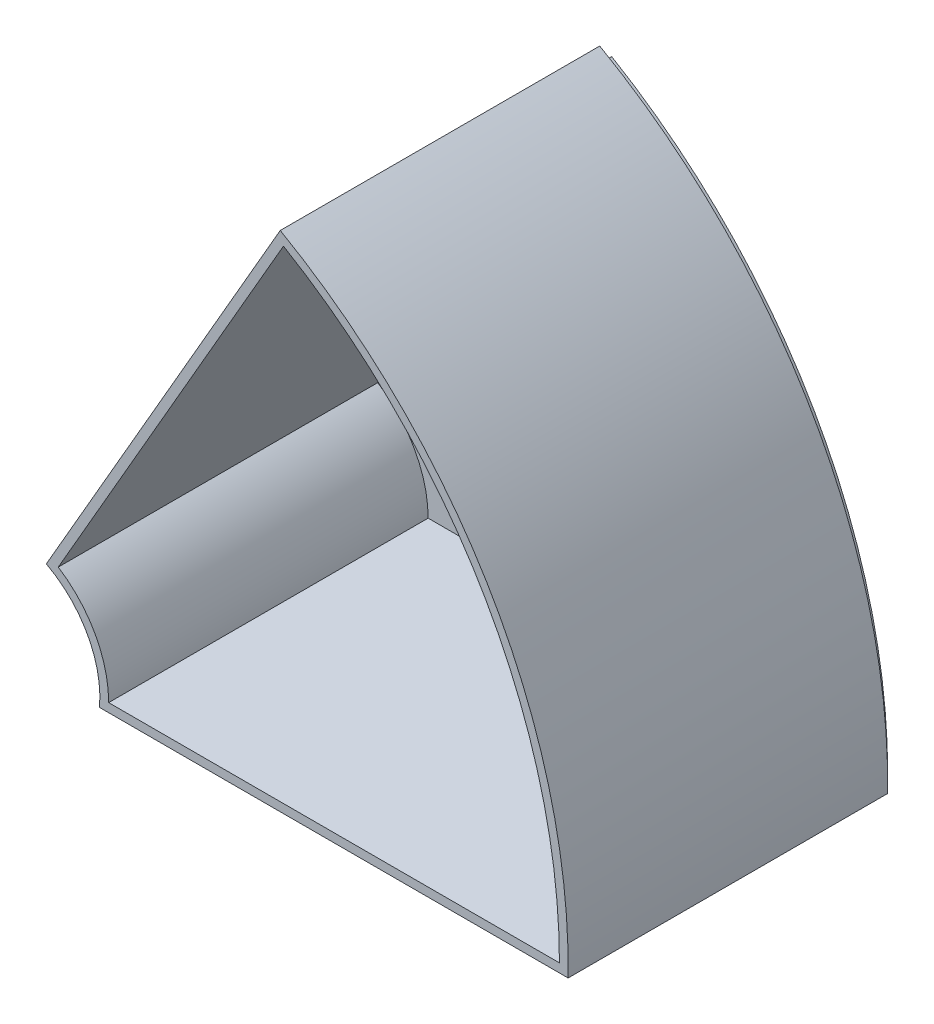
ISO-10303-21;
HEADER;
FILE_DESCRIPTION(('STEP AP214'),'2;1');
FILE_NAME('part.step','',(''),(''),'','','');
FILE_SCHEMA(('AUTOMOTIVE_DESIGN { 1 0 10303 214 1 1 1 1 }'));
ENDSEC;
DATA;
#1=APPLICATION_CONTEXT('core data for automotive mechanical design processes');
#2=APPLICATION_PROTOCOL_DEFINITION('international standard','automotive_design',2000,#1);
#3=PRODUCT_CONTEXT('',#1,'mechanical');
#4=PRODUCT('Part','Part','',(#3));
#5=PRODUCT_RELATED_PRODUCT_CATEGORY('part','',(#4));
#6=PRODUCT_DEFINITION_FORMATION('','',#4);
#7=PRODUCT_DEFINITION_CONTEXT('part definition',#1,'design');
#8=PRODUCT_DEFINITION('design','',#6,#7);
#9=PRODUCT_DEFINITION_SHAPE('','',#8);
#10=(LENGTH_UNIT() NAMED_UNIT(*) SI_UNIT(.MILLI.,.METRE.));
#11=(NAMED_UNIT(*) PLANE_ANGLE_UNIT() SI_UNIT($,.RADIAN.));
#12=(NAMED_UNIT(*) SI_UNIT($,.STERADIAN.) SOLID_ANGLE_UNIT());
#13=UNCERTAINTY_MEASURE_WITH_UNIT(LENGTH_MEASURE(1.E-05),#10,'distance_accuracy_value','');
#14=(GEOMETRIC_REPRESENTATION_CONTEXT(3) GLOBAL_UNCERTAINTY_ASSIGNED_CONTEXT((#13)) GLOBAL_UNIT_ASSIGNED_CONTEXT((#10,
#11,#12)) REPRESENTATION_CONTEXT('',''));
#15=CARTESIAN_POINT('',(0.,0.,0.));
#16=DIRECTION('',(0.,0.,1.));
#17=DIRECTION('',(1.,0.,0.));
#18=AXIS2_PLACEMENT_3D('',#15,#16,#17);
#19=CARTESIAN_POINT('',(0.,0.,75.));
#20=DIRECTION('',(0.,0.,1.));
#21=DIRECTION('',(1.,0.,0.));
#22=AXIS2_PLACEMENT_3D('',#19,#20,#21);
#23=PLANE('',#22);
#24=CARTESIAN_POINT('',(0.,0.,75.));
#25=DIRECTION('',(0.,0.,1.));
#26=DIRECTION('',(1.,0.,0.));
#27=AXIS2_PLACEMENT_3D('',#24,#25,#26);
#28=CIRCLE('',#27,130.);
#29=CARTESIAN_POINT('',(129.984614474175,-2.,75.));
#30=VERTEX_POINT('',#29);
#31=CARTESIAN_POINT('',(64.2088887219725,113.036359677271,75.));
#32=VERTEX_POINT('',#31);
#33=EDGE_CURVE('E178',#30,#32,#28,.T.);
#34=ORIENTED_EDGE('',*,*,#33,.T.);
#35=DIRECTION('',(-0.499499593515661,-0.866314120904011,0.));
#36=VECTOR('',#35,1.);
#37=CARTESIAN_POINT('',(63.2085928021995,111.301482428858,75.));
#38=LINE('',#37,#36);
#39=CARTESIAN_POINT('',(10.7561751051409,20.3298966329774,75.));
#40=VERTEX_POINT('',#39);
#41=EDGE_CURVE('E179',#32,#40,#38,.T.);
#42=ORIENTED_EDGE('',*,*,#41,.T.);
#43=CARTESIAN_POINT('',(0.,0.,75.));
#44=DIRECTION('',(0.,0.,1.));
#45=DIRECTION('',(1.,0.,0.));
#46=AXIS2_PLACEMENT_3D('',#43,#44,#45);
#47=CIRCLE('',#46,23.);
#48=CARTESIAN_POINT('',(22.9128784747792,-2.,75.));
#49=VERTEX_POINT('',#48);
#50=EDGE_CURVE('E185',#40,#49,#47,.F.);
#51=ORIENTED_EDGE('',*,*,#50,.T.);
#52=DIRECTION('',(1.,0.,0.));
#53=VECTOR('',#52,1.);
#54=CARTESIAN_POINT('',(25.,-2.,75.));
#55=LINE('',#54,#53);
#56=EDGE_CURVE('E184',#49,#30,#55,.T.);
#57=ORIENTED_EDGE('',*,*,#56,.T.);
#58=EDGE_LOOP('',(#34,#42,#51,#57));
#59=FACE_BOUND('',#58,.T.);
#60=DIRECTION('',(-0.499499593515661,-0.866314120904011,0.));
#61=VECTOR('',#60,1.);
#62=CARTESIAN_POINT('',(64.9412210440075,110.302483241826,75.));
#63=LINE('',#62,#61);
#64=CARTESIAN_POINT('',(64.9412210440075,110.302483241826,75.));
#65=VERTEX_POINT('',#64);
#66=CARTESIAN_POINT('',(13.481874136105,21.0532436878079,75.));
#67=VERTEX_POINT('',#66);
#68=EDGE_CURVE('E146',#65,#67,#63,.T.);
#69=ORIENTED_EDGE('',*,*,#68,.F.);
#70=CARTESIAN_POINT('',(0.,0.,75.));
#71=DIRECTION('',(0.,0.,1.));
#72=DIRECTION('',(1.,0.,0.));
#73=AXIS2_PLACEMENT_3D('',#70,#71,#72);
#74=CIRCLE('',#73,128.);
#75=CARTESIAN_POINT('',(128.,0.,75.));
#76=VERTEX_POINT('',#75);
#77=EDGE_CURVE('E137',#76,#65,#74,.T.);
#78=ORIENTED_EDGE('',*,*,#77,.F.);
#79=DIRECTION('',(1.,0.,0.));
#80=VECTOR('',#79,1.);
#81=CARTESIAN_POINT('',(25.,0.,75.));
#82=LINE('',#81,#80);
#83=CARTESIAN_POINT('',(25.,0.,75.));
#84=VERTEX_POINT('',#83);
#85=EDGE_CURVE('E165',#84,#76,#82,.T.);
#86=ORIENTED_EDGE('',*,*,#85,.F.);
#87=CARTESIAN_POINT('',(0.,0.,75.));
#88=DIRECTION('',(0.,0.,-1.));
#89=DIRECTION('',(1.,0.,0.));
#90=AXIS2_PLACEMENT_3D('',#87,#88,#89);
#91=CIRCLE('',#90,25.);
#92=EDGE_CURVE('E159',#67,#84,#91,.T.);
#93=ORIENTED_EDGE('',*,*,#92,.F.);
#94=EDGE_LOOP('',(#69,#78,#86,#93));
#95=FACE_BOUND('',#94,.T.);
#96=ADVANCED_FACE('F73',(#59,#95),#23,.T.);
#97=CARTESIAN_POINT('',(0.,0.,2.));
#98=DIRECTION('',(0.,0.,1.));
#99=DIRECTION('',(1.,0.,0.));
#100=AXIS2_PLACEMENT_3D('',#97,#98,#99);
#101=PLANE('',#100);
#102=CARTESIAN_POINT('',(0.,0.,2.));
#103=DIRECTION('',(0.,0.,1.));
#104=DIRECTION('',(1.,0.,0.));
#105=AXIS2_PLACEMENT_3D('',#102,#103,#104);
#106=CIRCLE('',#105,130.);
#107=CARTESIAN_POINT('',(129.984614474175,-2.,2.));
#108=VERTEX_POINT('',#107);
#109=CARTESIAN_POINT('',(64.2088887219725,113.036359677271,2.));
#110=VERTEX_POINT('',#109);
#111=EDGE_CURVE('E156',#108,#110,#106,.T.);
#112=ORIENTED_EDGE('',*,*,#111,.F.);
#113=DIRECTION('',(1.,0.,0.));
#114=VECTOR('',#113,1.);
#115=CARTESIAN_POINT('',(25.,-2.,2.));
#116=LINE('',#115,#114);
#117=CARTESIAN_POINT('',(22.9128784747792,-2.,2.));
#118=VERTEX_POINT('',#117);
#119=EDGE_CURVE('E177',#118,#108,#116,.T.);
#120=ORIENTED_EDGE('',*,*,#119,.F.);
#121=CARTESIAN_POINT('',(0.,0.,2.));
#122=DIRECTION('',(0.,0.,1.));
#123=DIRECTION('',(1.,0.,0.));
#124=AXIS2_PLACEMENT_3D('',#121,#122,#123);
#125=CIRCLE('',#124,23.);
#126=CARTESIAN_POINT('',(10.7561751051409,20.3298966329774,2.));
#127=VERTEX_POINT('',#126);
#128=EDGE_CURVE('E193',#127,#118,#125,.F.);
#129=ORIENTED_EDGE('',*,*,#128,.F.);
#130=DIRECTION('',(-0.499499593515661,-0.866314120904011,0.));
#131=VECTOR('',#130,1.);
#132=CARTESIAN_POINT('',(63.2085928021995,111.301482428858,2.));
#133=LINE('',#132,#131);
#134=EDGE_CURVE('E188',#110,#127,#133,.T.);
#135=ORIENTED_EDGE('',*,*,#134,.F.);
#136=EDGE_LOOP('',(#112,#120,#129,#135));
#137=FACE_BOUND('',#136,.T.);
#138=CARTESIAN_POINT('',(0.,0.,2.));
#139=DIRECTION('',(0.,0.,1.));
#140=DIRECTION('',(1.,0.,0.));
#141=AXIS2_PLACEMENT_3D('',#138,#139,#140);
#142=CIRCLE('',#141,128.);
#143=CARTESIAN_POINT('',(128.,0.,2.));
#144=VERTEX_POINT('',#143);
#145=CARTESIAN_POINT('',(64.9412210440075,110.302483241826,2.));
#146=VERTEX_POINT('',#145);
#147=EDGE_CURVE('E98',#144,#146,#142,.T.);
#148=ORIENTED_EDGE('',*,*,#147,.T.);
#149=DIRECTION('',(-0.499499593515661,-0.866314120904011,0.));
#150=VECTOR('',#149,1.);
#151=CARTESIAN_POINT('',(64.9412210440075,110.302483241826,2.));
#152=LINE('',#151,#150);
#153=CARTESIAN_POINT('',(13.481874136105,21.0532436878079,2.));
#154=VERTEX_POINT('',#153);
#155=EDGE_CURVE('E154',#146,#154,#152,.T.);
#156=ORIENTED_EDGE('',*,*,#155,.T.);
#157=CARTESIAN_POINT('',(0.,0.,2.));
#158=DIRECTION('',(0.,0.,-1.));
#159=DIRECTION('',(1.,0.,0.));
#160=AXIS2_PLACEMENT_3D('',#157,#158,#159);
#161=CIRCLE('',#160,25.);
#162=CARTESIAN_POINT('',(25.,0.,2.));
#163=VERTEX_POINT('',#162);
#164=EDGE_CURVE('E169',#154,#163,#161,.T.);
#165=ORIENTED_EDGE('',*,*,#164,.T.);
#166=DIRECTION('',(1.,0.,0.));
#167=VECTOR('',#166,1.);
#168=CARTESIAN_POINT('',(25.,0.,2.));
#169=LINE('',#168,#167);
#170=EDGE_CURVE('E149',#163,#144,#169,.T.);
#171=ORIENTED_EDGE('',*,*,#170,.T.);
#172=EDGE_LOOP('',(#148,#156,#165,#171));
#173=FACE_BOUND('',#172,.T.);
#174=ADVANCED_FACE('F207',(#137,#173),#101,.F.);
#175=CARTESIAN_POINT('',(0.,0.,75.));
#176=DIRECTION('',(0.,0.,-1.));
#177=DIRECTION('',(-1.,0.,0.));
#178=AXIS2_PLACEMENT_3D('',#175,#176,#177);
#179=CYLINDRICAL_SURFACE('',#178,130.);
#180=ORIENTED_EDGE('',*,*,#111,.T.);
#181=DIRECTION('',(0.,0.,-1.));
#182=VECTOR('',#181,1.);
#183=CARTESIAN_POINT('',(64.2088887219725,113.036359677271,75.));
#184=LINE('',#183,#182);
#185=EDGE_CURVE('E13',#32,#110,#184,.T.);
#186=ORIENTED_EDGE('',*,*,#185,.F.);
#187=ORIENTED_EDGE('',*,*,#33,.F.);
#188=DIRECTION('',(0.,0.,-1.));
#189=VECTOR('',#188,1.);
#190=CARTESIAN_POINT('',(129.984614474175,-2.,75.));
#191=LINE('',#190,#189);
#192=EDGE_CURVE('E186',#30,#108,#191,.T.);
#193=ORIENTED_EDGE('',*,*,#192,.T.);
#194=EDGE_LOOP('',(#180,#186,#187,#193));
#195=FACE_BOUND('',#194,.T.);
#196=ADVANCED_FACE('F77',(#195),#179,.T.);
#197=CARTESIAN_POINT('',(63.2085928021995,111.301482428858,75.));
#198=DIRECTION('',(0.866314120904011,-0.499499593515661,0.));
#199=DIRECTION('',(0.499499593515661,0.866314120904011,0.));
#200=AXIS2_PLACEMENT_3D('',#197,#198,#199);
#201=PLANE('',#200);
#202=ORIENTED_EDGE('',*,*,#134,.T.);
#203=DIRECTION('',(0.,0.,-1.));
#204=VECTOR('',#203,1.);
#205=CARTESIAN_POINT('',(10.7561751051409,20.3298966329774,75.));
#206=LINE('',#205,#204);
#207=EDGE_CURVE('E81',#40,#127,#206,.T.);
#208=ORIENTED_EDGE('',*,*,#207,.F.);
#209=ORIENTED_EDGE('',*,*,#41,.F.);
#210=ORIENTED_EDGE('',*,*,#185,.T.);
#211=EDGE_LOOP('',(#202,#208,#209,#210));
#212=FACE_BOUND('',#211,.T.);
#213=ADVANCED_FACE('F218',(#212),#201,.F.);
#214=CARTESIAN_POINT('',(0.,0.,75.));
#215=DIRECTION('',(0.,0.,-1.));
#216=DIRECTION('',(-1.,0.,0.));
#217=AXIS2_PLACEMENT_3D('',#214,#215,#216);
#218=CYLINDRICAL_SURFACE('',#217,23.);
#219=ORIENTED_EDGE('',*,*,#128,.T.);
#220=DIRECTION('',(0.,0.,-1.));
#221=VECTOR('',#220,1.);
#222=CARTESIAN_POINT('',(22.9128784747792,-2.,75.));
#223=LINE('',#222,#221);
#224=EDGE_CURVE('E198',#49,#118,#223,.T.);
#225=ORIENTED_EDGE('',*,*,#224,.F.);
#226=ORIENTED_EDGE('',*,*,#50,.F.);
#227=ORIENTED_EDGE('',*,*,#207,.T.);
#228=EDGE_LOOP('',(#219,#225,#226,#227));
#229=FACE_BOUND('',#228,.T.);
#230=ADVANCED_FACE('F201',(#229),#218,.F.);
#231=CARTESIAN_POINT('',(25.,-2.,75.));
#232=DIRECTION('',(0.,1.,0.));
#233=DIRECTION('',(0.,0.,1.));
#234=AXIS2_PLACEMENT_3D('',#231,#232,#233);
#235=PLANE('',#234);
#236=ORIENTED_EDGE('',*,*,#119,.T.);
#237=ORIENTED_EDGE('',*,*,#192,.F.);
#238=ORIENTED_EDGE('',*,*,#56,.F.);
#239=ORIENTED_EDGE('',*,*,#224,.T.);
#240=EDGE_LOOP('',(#236,#237,#238,#239));
#241=FACE_BOUND('',#240,.T.);
#242=ADVANCED_FACE('F213',(#241),#235,.F.);
#243=CARTESIAN_POINT('',(0.,0.,75.));
#244=DIRECTION('',(0.,0.,-1.));
#245=DIRECTION('',(-1.,0.,0.));
#246=AXIS2_PLACEMENT_3D('',#243,#244,#245);
#247=CYLINDRICAL_SURFACE('',#246,128.);
#248=ORIENTED_EDGE('',*,*,#147,.F.);
#249=DIRECTION('',(0.,0.,-1.));
#250=VECTOR('',#249,1.);
#251=CARTESIAN_POINT('',(128.,0.,75.));
#252=LINE('',#251,#250);
#253=EDGE_CURVE('E145',#76,#144,#252,.T.);
#254=ORIENTED_EDGE('',*,*,#253,.F.);
#255=ORIENTED_EDGE('',*,*,#77,.T.);
#256=DIRECTION('',(0.,0.,-1.));
#257=VECTOR('',#256,1.);
#258=CARTESIAN_POINT('',(64.9412210440075,110.302483241826,75.));
#259=LINE('',#258,#257);
#260=EDGE_CURVE('E141',#65,#146,#259,.T.);
#261=ORIENTED_EDGE('',*,*,#260,.T.);
#262=EDGE_LOOP('',(#248,#254,#255,#261));
#263=FACE_BOUND('',#262,.T.);
#264=ADVANCED_FACE('F142',(#263),#247,.F.);
#265=CARTESIAN_POINT('',(64.9412210440075,110.302483241826,75.));
#266=DIRECTION('',(0.866314120904011,-0.499499593515661,0.));
#267=DIRECTION('',(0.499499593515661,0.866314120904011,0.));
#268=AXIS2_PLACEMENT_3D('',#265,#266,#267);
#269=PLANE('',#268);
#270=ORIENTED_EDGE('',*,*,#155,.F.);
#271=ORIENTED_EDGE('',*,*,#260,.F.);
#272=ORIENTED_EDGE('',*,*,#68,.T.);
#273=DIRECTION('',(0.,0.,-1.));
#274=VECTOR('',#273,1.);
#275=CARTESIAN_POINT('',(13.481874136105,21.0532436878079,75.));
#276=LINE('',#275,#274);
#277=EDGE_CURVE('E160',#67,#154,#276,.T.);
#278=ORIENTED_EDGE('',*,*,#277,.T.);
#279=EDGE_LOOP('',(#270,#271,#272,#278));
#280=FACE_BOUND('',#279,.T.);
#281=ADVANCED_FACE('F155',(#280),#269,.T.);
#282=CARTESIAN_POINT('',(0.,0.,75.));
#283=DIRECTION('',(0.,0.,-1.));
#284=DIRECTION('',(-1.,0.,0.));
#285=AXIS2_PLACEMENT_3D('',#282,#283,#284);
#286=CYLINDRICAL_SURFACE('',#285,25.);
#287=ORIENTED_EDGE('',*,*,#164,.F.);
#288=ORIENTED_EDGE('',*,*,#277,.F.);
#289=ORIENTED_EDGE('',*,*,#92,.T.);
#290=DIRECTION('',(0.,0.,-1.));
#291=VECTOR('',#290,1.);
#292=CARTESIAN_POINT('',(25.,0.,75.));
#293=LINE('',#292,#291);
#294=EDGE_CURVE('E89',#84,#163,#293,.T.);
#295=ORIENTED_EDGE('',*,*,#294,.T.);
#296=EDGE_LOOP('',(#287,#288,#289,#295));
#297=FACE_BOUND('',#296,.T.);
#298=ADVANCED_FACE('F242',(#297),#286,.T.);
#299=CARTESIAN_POINT('',(25.,0.,75.));
#300=DIRECTION('',(0.,1.,0.));
#301=DIRECTION('',(0.,0.,1.));
#302=AXIS2_PLACEMENT_3D('',#299,#300,#301);
#303=PLANE('',#302);
#304=ORIENTED_EDGE('',*,*,#170,.F.);
#305=ORIENTED_EDGE('',*,*,#294,.F.);
#306=ORIENTED_EDGE('',*,*,#85,.T.);
#307=ORIENTED_EDGE('',*,*,#253,.T.);
#308=EDGE_LOOP('',(#304,#305,#306,#307));
#309=FACE_BOUND('',#308,.T.);
#310=ADVANCED_FACE('F248',(#309),#303,.T.);
#311=CLOSED_SHELL('',(#96,#174,#196,#213,#230,#242,#264,#281,#298,#310));
#312=MANIFOLD_SOLID_BREP('B2',#311);
#313=CARTESIAN_POINT('',(0.,0.,2.));
#314=DIRECTION('',(0.,0.,-1.));
#315=DIRECTION('',(-1.,0.,0.));
#316=AXIS2_PLACEMENT_3D('',#313,#314,#315);
#317=CYLINDRICAL_SURFACE('',#316,25.);
#318=CARTESIAN_POINT('',(0.,0.,0.));
#319=DIRECTION('',(0.,0.,-1.));
#320=DIRECTION('',(-1.,0.,0.));
#321=AXIS2_PLACEMENT_3D('',#318,#319,#320);
#322=CIRCLE('',#321,25.);
#323=CARTESIAN_POINT('',(13.481874136105,21.0532436878079,0.));
#324=VERTEX_POINT('',#323);
#325=CARTESIAN_POINT('',(25.,0.,0.));
#326=VERTEX_POINT('',#325);
#327=EDGE_CURVE('E366',#324,#326,#322,.T.);
#328=ORIENTED_EDGE('',*,*,#327,.T.);
#329=DIRECTION('',(0.,0.,-1.));
#330=VECTOR('',#329,1.);
#331=CARTESIAN_POINT('',(25.,0.,2.));
#332=LINE('',#331,#330);
#333=CARTESIAN_POINT('',(25.,0.,2.));
#334=VERTEX_POINT('',#333);
#335=EDGE_CURVE('E71',#334,#326,#332,.T.);
#336=ORIENTED_EDGE('',*,*,#335,.F.);
#337=CARTESIAN_POINT('',(0.,0.,2.));
#338=DIRECTION('',(0.,0.,-1.));
#339=DIRECTION('',(-1.,0.,0.));
#340=AXIS2_PLACEMENT_3D('',#337,#338,#339);
#341=CIRCLE('',#340,25.);
#342=CARTESIAN_POINT('',(13.481874136105,21.0532436878079,2.));
#343=VERTEX_POINT('',#342);
#344=EDGE_CURVE('E358',#343,#334,#341,.T.);
#345=ORIENTED_EDGE('',*,*,#344,.F.);
#346=DIRECTION('',(0.,0.,-1.));
#347=VECTOR('',#346,1.);
#348=CARTESIAN_POINT('',(13.481874136105,21.0532436878079,2.));
#349=LINE('',#348,#347);
#350=EDGE_CURVE('E365',#343,#324,#349,.T.);
#351=ORIENTED_EDGE('',*,*,#350,.T.);
#352=EDGE_LOOP('',(#328,#336,#345,#351));
#353=FACE_BOUND('',#352,.T.);
#354=ADVANCED_FACE('F302',(#353),#317,.F.);
#355=CARTESIAN_POINT('',(25.,0.,2.));
#356=DIRECTION('',(0.,1.,0.));
#357=DIRECTION('',(0.,0.,1.));
#358=AXIS2_PLACEMENT_3D('',#355,#356,#357);
#359=PLANE('',#358);
#360=DIRECTION('',(1.,0.,0.));
#361=VECTOR('',#360,1.);
#362=CARTESIAN_POINT('',(25.,0.,0.));
#363=LINE('',#362,#361);
#364=CARTESIAN_POINT('',(128.,0.,0.));
#365=VERTEX_POINT('',#364);
#366=EDGE_CURVE('E357',#326,#365,#363,.T.);
#367=ORIENTED_EDGE('',*,*,#366,.T.);
#368=DIRECTION('',(0.,0.,-1.));
#369=VECTOR('',#368,1.);
#370=CARTESIAN_POINT('',(128.,0.,2.));
#371=LINE('',#370,#369);
#372=CARTESIAN_POINT('',(128.,0.,2.));
#373=VERTEX_POINT('',#372);
#374=EDGE_CURVE('E311',#373,#365,#371,.T.);
#375=ORIENTED_EDGE('',*,*,#374,.F.);
#376=DIRECTION('',(1.,0.,0.));
#377=VECTOR('',#376,1.);
#378=CARTESIAN_POINT('',(25.,0.,2.));
#379=LINE('',#378,#377);
#380=EDGE_CURVE('E351',#334,#373,#379,.T.);
#381=ORIENTED_EDGE('',*,*,#380,.F.);
#382=ORIENTED_EDGE('',*,*,#335,.T.);
#383=EDGE_LOOP('',(#367,#375,#381,#382));
#384=FACE_BOUND('',#383,.T.);
#385=ADVANCED_FACE('F359',(#384),#359,.F.);
#386=CARTESIAN_POINT('',(0.,0.,2.));
#387=DIRECTION('',(0.,0.,-1.));
#388=DIRECTION('',(-1.,0.,0.));
#389=AXIS2_PLACEMENT_3D('',#386,#387,#388);
#390=CYLINDRICAL_SURFACE('',#389,128.);
#391=CARTESIAN_POINT('',(0.,0.,0.));
#392=DIRECTION('',(0.,0.,1.));
#393=DIRECTION('',(1.,0.,0.));
#394=AXIS2_PLACEMENT_3D('',#391,#392,#393);
#395=CIRCLE('',#394,128.);
#396=CARTESIAN_POINT('',(64.9412210440075,110.302483241826,0.));
#397=VERTEX_POINT('',#396);
#398=EDGE_CURVE('E339',#365,#397,#395,.T.);
#399=ORIENTED_EDGE('',*,*,#398,.T.);
#400=DIRECTION('',(0.,0.,-1.));
#401=VECTOR('',#400,1.);
#402=CARTESIAN_POINT('',(64.9412210440075,110.302483241826,2.));
#403=LINE('',#402,#401);
#404=CARTESIAN_POINT('',(64.9412210440075,110.302483241826,2.));
#405=VERTEX_POINT('',#404);
#406=EDGE_CURVE('E363',#405,#397,#403,.T.);
#407=ORIENTED_EDGE('',*,*,#406,.F.);
#408=CARTESIAN_POINT('',(0.,0.,2.));
#409=DIRECTION('',(0.,0.,1.));
#410=DIRECTION('',(1.,0.,0.));
#411=AXIS2_PLACEMENT_3D('',#408,#409,#410);
#412=CIRCLE('',#411,128.);
#413=EDGE_CURVE('E353',#373,#405,#412,.T.);
#414=ORIENTED_EDGE('',*,*,#413,.F.);
#415=ORIENTED_EDGE('',*,*,#374,.T.);
#416=EDGE_LOOP('',(#399,#407,#414,#415));
#417=FACE_BOUND('',#416,.T.);
#418=ADVANCED_FACE('F362',(#417),#390,.T.);
#419=CARTESIAN_POINT('',(13.481874136105,21.0532436878079,2.));
#420=DIRECTION('',(0.866314120904011,-0.499499593515661,0.));
#421=DIRECTION('',(0.499499593515661,0.866314120904011,0.));
#422=AXIS2_PLACEMENT_3D('',#419,#420,#421);
#423=PLANE('',#422);
#424=DIRECTION('',(-0.499499593515661,-0.866314120904011,0.));
#425=VECTOR('',#424,1.);
#426=CARTESIAN_POINT('',(13.481874136105,21.0532436878079,0.));
#427=LINE('',#426,#425);
#428=EDGE_CURVE('E344',#397,#324,#427,.T.);
#429=ORIENTED_EDGE('',*,*,#428,.T.);
#430=ORIENTED_EDGE('',*,*,#350,.F.);
#431=DIRECTION('',(-0.499499593515661,-0.866314120904011,0.));
#432=VECTOR('',#431,1.);
#433=CARTESIAN_POINT('',(13.481874136105,21.0532436878079,2.));
#434=LINE('',#433,#432);
#435=EDGE_CURVE('E321',#405,#343,#434,.T.);
#436=ORIENTED_EDGE('',*,*,#435,.F.);
#437=ORIENTED_EDGE('',*,*,#406,.T.);
#438=EDGE_LOOP('',(#429,#430,#436,#437));
#439=FACE_BOUND('',#438,.T.);
#440=ADVANCED_FACE('F374',(#439),#423,.F.);
#441=CARTESIAN_POINT('',(0.,0.,2.));
#442=DIRECTION('',(0.,0.,-1.));
#443=DIRECTION('',(-1.,0.,0.));
#444=AXIS2_PLACEMENT_3D('',#441,#442,#443);
#445=PLANE('',#444);
#446=ORIENTED_EDGE('',*,*,#344,.T.);
#447=ORIENTED_EDGE('',*,*,#380,.T.);
#448=ORIENTED_EDGE('',*,*,#413,.T.);
#449=ORIENTED_EDGE('',*,*,#435,.T.);
#450=EDGE_LOOP('',(#446,#447,#448,#449));
#451=FACE_BOUND('',#450,.T.);
#452=ADVANCED_FACE('F352',(#451),#445,.F.);
#453=CARTESIAN_POINT('',(0.,0.,0.));
#454=DIRECTION('',(0.,0.,-1.));
#455=DIRECTION('',(-1.,0.,0.));
#456=AXIS2_PLACEMENT_3D('',#453,#454,#455);
#457=PLANE('',#456);
#458=ORIENTED_EDGE('',*,*,#327,.F.);
#459=ORIENTED_EDGE('',*,*,#428,.F.);
#460=ORIENTED_EDGE('',*,*,#398,.F.);
#461=ORIENTED_EDGE('',*,*,#366,.F.);
#462=EDGE_LOOP('',(#458,#459,#460,#461));
#463=FACE_BOUND('',#462,.T.);
#464=ADVANCED_FACE('F378',(#463),#457,.T.);
#465=CLOSED_SHELL('',(#354,#385,#418,#440,#452,#464));
#466=MANIFOLD_SOLID_BREP('B7',#465);
#467=ADVANCED_BREP_SHAPE_REPRESENTATION('',(#18,#312,#466),#14);
#468=SHAPE_DEFINITION_REPRESENTATION(#9,#467);
ENDSEC;
END-ISO-10303-21;
